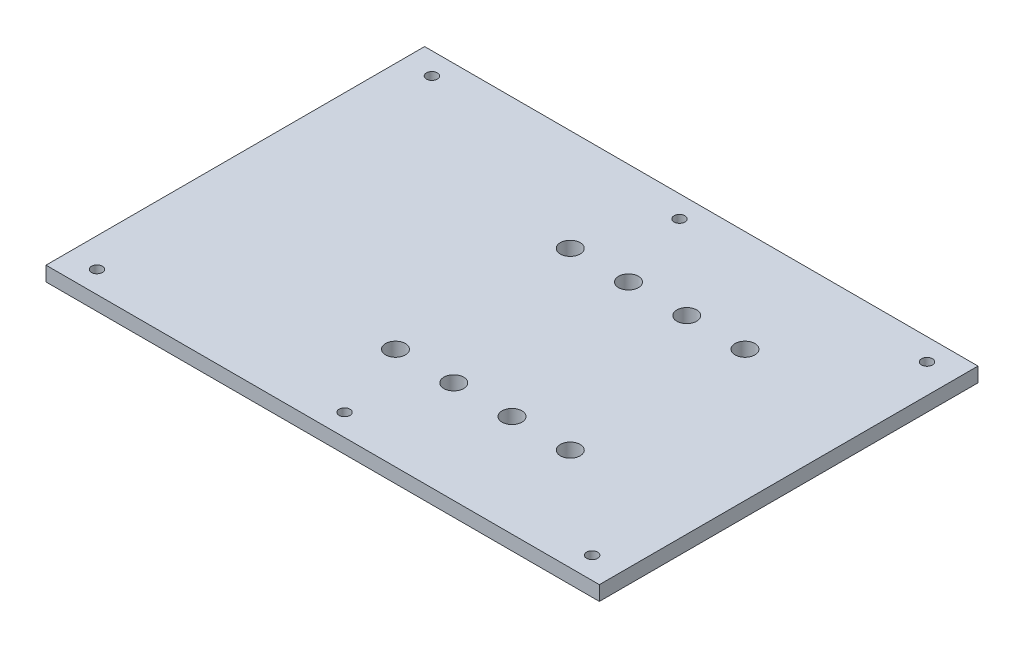
ISO-10303-21;
HEADER;
FILE_DESCRIPTION(('STEP AP214'),'2;1');
FILE_NAME('part.step','',(''),(''),'','','');
FILE_SCHEMA(('AUTOMOTIVE_DESIGN { 1 0 10303 214 1 1 1 1 }'));
ENDSEC;
DATA;
#1=APPLICATION_CONTEXT('core data for automotive mechanical design processes');
#2=APPLICATION_PROTOCOL_DEFINITION('international standard','automotive_design',2000,#1);
#3=PRODUCT_CONTEXT('',#1,'mechanical');
#4=PRODUCT('Part','Part','',(#3));
#5=PRODUCT_RELATED_PRODUCT_CATEGORY('part','',(#4));
#6=PRODUCT_DEFINITION_FORMATION('','',#4);
#7=PRODUCT_DEFINITION_CONTEXT('part definition',#1,'design');
#8=PRODUCT_DEFINITION('design','',#6,#7);
#9=PRODUCT_DEFINITION_SHAPE('','',#8);
#10=(LENGTH_UNIT() NAMED_UNIT(*) SI_UNIT(.MILLI.,.METRE.));
#11=(NAMED_UNIT(*) PLANE_ANGLE_UNIT() SI_UNIT($,.RADIAN.));
#12=(NAMED_UNIT(*) SI_UNIT($,.STERADIAN.) SOLID_ANGLE_UNIT());
#13=UNCERTAINTY_MEASURE_WITH_UNIT(LENGTH_MEASURE(1.E-05),#10,'distance_accuracy_value','');
#14=(GEOMETRIC_REPRESENTATION_CONTEXT(3) GLOBAL_UNCERTAINTY_ASSIGNED_CONTEXT((#13)) GLOBAL_UNIT_ASSIGNED_CONTEXT((#10,
#11,#12)) REPRESENTATION_CONTEXT('',''));
#15=CARTESIAN_POINT('',(0.,0.,0.));
#16=DIRECTION('',(0.,0.,1.));
#17=DIRECTION('',(1.,0.,0.));
#18=AXIS2_PLACEMENT_3D('',#15,#16,#17);
#19=CARTESIAN_POINT('',(241.3,12.7,-165.1));
#20=DIRECTION('',(-1.,0.,0.));
#21=DIRECTION('',(0.,0.,1.));
#22=AXIS2_PLACEMENT_3D('',#19,#20,#21);
#23=PLANE('',#22);
#24=DIRECTION('',(0.,0.,-1.));
#25=VECTOR('',#24,1.);
#26=CARTESIAN_POINT('',(241.3,0.,-165.1));
#27=LINE('',#26,#25);
#28=CARTESIAN_POINT('',(241.3,0.,165.1));
#29=VERTEX_POINT('',#28);
#30=CARTESIAN_POINT('',(241.3,0.,-165.1));
#31=VERTEX_POINT('',#30);
#32=EDGE_CURVE('E102',#29,#31,#27,.T.);
#33=ORIENTED_EDGE('',*,*,#32,.T.);
#34=DIRECTION('',(0.,-1.,0.));
#35=VECTOR('',#34,1.);
#36=CARTESIAN_POINT('',(241.3,12.7,-165.1));
#37=LINE('',#36,#35);
#38=CARTESIAN_POINT('',(241.3,12.7,-165.1));
#39=VERTEX_POINT('',#38);
#40=EDGE_CURVE('E11',#39,#31,#37,.T.);
#41=ORIENTED_EDGE('',*,*,#40,.F.);
#42=DIRECTION('',(0.,0.,-1.));
#43=VECTOR('',#42,1.);
#44=CARTESIAN_POINT('',(241.3,12.7,-165.1));
#45=LINE('',#44,#43);
#46=CARTESIAN_POINT('',(241.3,12.7,165.1));
#47=VERTEX_POINT('',#46);
#48=EDGE_CURVE('E90',#47,#39,#45,.T.);
#49=ORIENTED_EDGE('',*,*,#48,.F.);
#50=DIRECTION('',(0.,-1.,0.));
#51=VECTOR('',#50,1.);
#52=CARTESIAN_POINT('',(241.3,12.7,165.1));
#53=LINE('',#52,#51);
#54=EDGE_CURVE('E98',#47,#29,#53,.T.);
#55=ORIENTED_EDGE('',*,*,#54,.T.);
#56=EDGE_LOOP('',(#33,#41,#49,#55));
#57=FACE_BOUND('',#56,.T.);
#58=ADVANCED_FACE('F39',(#57),#23,.F.);
#59=CARTESIAN_POINT('',(-241.3,12.7,-165.1));
#60=DIRECTION('',(0.,0.,1.));
#61=DIRECTION('',(1.,0.,0.));
#62=AXIS2_PLACEMENT_3D('',#59,#60,#61);
#63=PLANE('',#62);
#64=DIRECTION('',(-1.,0.,0.));
#65=VECTOR('',#64,1.);
#66=CARTESIAN_POINT('',(-241.3,0.,-165.1));
#67=LINE('',#66,#65);
#68=CARTESIAN_POINT('',(-241.3,0.,-165.1));
#69=VERTEX_POINT('',#68);
#70=EDGE_CURVE('E94',#31,#69,#67,.T.);
#71=ORIENTED_EDGE('',*,*,#70,.T.);
#72=DIRECTION('',(0.,-1.,0.));
#73=VECTOR('',#72,1.);
#74=CARTESIAN_POINT('',(-241.3,12.7,-165.1));
#75=LINE('',#74,#73);
#76=CARTESIAN_POINT('',(-241.3,12.7,-165.1));
#77=VERTEX_POINT('',#76);
#78=EDGE_CURVE('E47',#77,#69,#75,.T.);
#79=ORIENTED_EDGE('',*,*,#78,.F.);
#80=DIRECTION('',(-1.,0.,0.));
#81=VECTOR('',#80,1.);
#82=CARTESIAN_POINT('',(-241.3,12.7,-165.1));
#83=LINE('',#82,#81);
#84=EDGE_CURVE('E85',#39,#77,#83,.T.);
#85=ORIENTED_EDGE('',*,*,#84,.F.);
#86=ORIENTED_EDGE('',*,*,#40,.T.);
#87=EDGE_LOOP('',(#71,#79,#85,#86));
#88=FACE_BOUND('',#87,.T.);
#89=ADVANCED_FACE('F93',(#88),#63,.F.);
#90=CARTESIAN_POINT('',(-241.3,12.7,-165.1));
#91=DIRECTION('',(1.,0.,0.));
#92=DIRECTION('',(0.,0.,-1.));
#93=AXIS2_PLACEMENT_3D('',#90,#91,#92);
#94=PLANE('',#93);
#95=DIRECTION('',(0.,0.,1.));
#96=VECTOR('',#95,1.);
#97=CARTESIAN_POINT('',(-241.3,0.,-165.1));
#98=LINE('',#97,#96);
#99=CARTESIAN_POINT('',(-241.3,0.,165.1));
#100=VERTEX_POINT('',#99);
#101=EDGE_CURVE('E72',#69,#100,#98,.T.);
#102=ORIENTED_EDGE('',*,*,#101,.T.);
#103=DIRECTION('',(0.,-1.,0.));
#104=VECTOR('',#103,1.);
#105=CARTESIAN_POINT('',(-241.3,12.7,165.1));
#106=LINE('',#105,#104);
#107=CARTESIAN_POINT('',(-241.3,12.7,165.1));
#108=VERTEX_POINT('',#107);
#109=EDGE_CURVE('E95',#108,#100,#106,.T.);
#110=ORIENTED_EDGE('',*,*,#109,.F.);
#111=DIRECTION('',(0.,0.,1.));
#112=VECTOR('',#111,1.);
#113=CARTESIAN_POINT('',(-241.3,12.7,-165.1));
#114=LINE('',#113,#112);
#115=EDGE_CURVE('E88',#77,#108,#114,.T.);
#116=ORIENTED_EDGE('',*,*,#115,.F.);
#117=ORIENTED_EDGE('',*,*,#78,.T.);
#118=EDGE_LOOP('',(#102,#110,#116,#117));
#119=FACE_BOUND('',#118,.T.);
#120=ADVANCED_FACE('F96',(#119),#94,.F.);
#121=CARTESIAN_POINT('',(-241.3,12.7,165.1));
#122=DIRECTION('',(0.,0.,-1.));
#123=DIRECTION('',(-1.,0.,0.));
#124=AXIS2_PLACEMENT_3D('',#121,#122,#123);
#125=PLANE('',#124);
#126=DIRECTION('',(1.,0.,0.));
#127=VECTOR('',#126,1.);
#128=CARTESIAN_POINT('',(-241.3,0.,165.1));
#129=LINE('',#128,#127);
#130=EDGE_CURVE('E78',#100,#29,#129,.T.);
#131=ORIENTED_EDGE('',*,*,#130,.T.);
#132=ORIENTED_EDGE('',*,*,#54,.F.);
#133=DIRECTION('',(1.,0.,0.));
#134=VECTOR('',#133,1.);
#135=CARTESIAN_POINT('',(-241.3,12.7,165.1));
#136=LINE('',#135,#134);
#137=EDGE_CURVE('E55',#108,#47,#136,.T.);
#138=ORIENTED_EDGE('',*,*,#137,.F.);
#139=ORIENTED_EDGE('',*,*,#109,.T.);
#140=EDGE_LOOP('',(#131,#132,#138,#139));
#141=FACE_BOUND('',#140,.T.);
#142=ADVANCED_FACE('F110',(#141),#125,.F.);
#143=CARTESIAN_POINT('',(0.,12.7,0.));
#144=DIRECTION('',(0.,1.,0.));
#145=DIRECTION('',(0.,0.,1.));
#146=AXIS2_PLACEMENT_3D('',#143,#144,#145);
#147=PLANE('',#146);
#148=CARTESIAN_POINT('',(25.3999999999998,12.7,-76.2));
#149=DIRECTION('',(0.,1.,0.));
#150=DIRECTION('',(0.,0.,1.));
#151=AXIS2_PLACEMENT_3D('',#148,#149,#150);
#152=CIRCLE('',#151,8.636);
#153=CARTESIAN_POINT('',(25.3999999999998,12.7,-67.564));
#154=VERTEX_POINT('',#153);
#155=EDGE_CURVE('E151',#154,#154,#152,.T.);
#156=ORIENTED_EDGE('',*,*,#155,.F.);
#157=EDGE_LOOP('',(#156));
#158=FACE_BOUND('',#157,.T.);
#159=CARTESIAN_POINT('',(76.1999999999998,12.7,-76.2));
#160=DIRECTION('',(0.,1.,0.));
#161=DIRECTION('',(0.,0.,1.));
#162=AXIS2_PLACEMENT_3D('',#159,#160,#161);
#163=CIRCLE('',#162,8.63600000000001);
#164=CARTESIAN_POINT('',(76.1999999999998,12.7,-67.564));
#165=VERTEX_POINT('',#164);
#166=EDGE_CURVE('E154',#165,#165,#163,.T.);
#167=ORIENTED_EDGE('',*,*,#166,.F.);
#168=EDGE_LOOP('',(#167));
#169=FACE_BOUND('',#168,.T.);
#170=CARTESIAN_POINT('',(127.,12.7,-76.2));
#171=DIRECTION('',(0.,1.,0.));
#172=DIRECTION('',(0.,0.,1.));
#173=AXIS2_PLACEMENT_3D('',#170,#171,#172);
#174=CIRCLE('',#173,8.63600000000001);
#175=CARTESIAN_POINT('',(127.,12.7,-67.564));
#176=VERTEX_POINT('',#175);
#177=EDGE_CURVE('E157',#176,#176,#174,.T.);
#178=ORIENTED_EDGE('',*,*,#177,.F.);
#179=EDGE_LOOP('',(#178));
#180=FACE_BOUND('',#179,.T.);
#181=CARTESIAN_POINT('',(127.,12.7,76.2));
#182=DIRECTION('',(0.,1.,0.));
#183=DIRECTION('',(0.,0.,1.));
#184=AXIS2_PLACEMENT_3D('',#181,#182,#183);
#185=CIRCLE('',#184,8.63600000000001);
#186=CARTESIAN_POINT('',(127.,12.7,84.836));
#187=VERTEX_POINT('',#186);
#188=EDGE_CURVE('E160',#187,#187,#185,.T.);
#189=ORIENTED_EDGE('',*,*,#188,.F.);
#190=EDGE_LOOP('',(#189));
#191=FACE_BOUND('',#190,.T.);
#192=CARTESIAN_POINT('',(76.1999999999998,12.7,76.2));
#193=DIRECTION('',(0.,1.,0.));
#194=DIRECTION('',(0.,0.,1.));
#195=AXIS2_PLACEMENT_3D('',#192,#193,#194);
#196=CIRCLE('',#195,8.63600000000001);
#197=CARTESIAN_POINT('',(76.1999999999998,12.7,84.836));
#198=VERTEX_POINT('',#197);
#199=EDGE_CURVE('E163',#198,#198,#196,.T.);
#200=ORIENTED_EDGE('',*,*,#199,.F.);
#201=EDGE_LOOP('',(#200));
#202=FACE_BOUND('',#201,.T.);
#203=CARTESIAN_POINT('',(25.3999999999998,12.7,76.2));
#204=DIRECTION('',(0.,1.,0.));
#205=DIRECTION('',(0.,0.,1.));
#206=AXIS2_PLACEMENT_3D('',#203,#204,#205);
#207=CIRCLE('',#206,8.636);
#208=CARTESIAN_POINT('',(25.3999999999998,12.7,84.836));
#209=VERTEX_POINT('',#208);
#210=EDGE_CURVE('E166',#209,#209,#207,.T.);
#211=ORIENTED_EDGE('',*,*,#210,.F.);
#212=EDGE_LOOP('',(#211));
#213=FACE_BOUND('',#212,.T.);
#214=CARTESIAN_POINT('',(-25.4000000000002,12.7,76.2));
#215=DIRECTION('',(0.,1.,0.));
#216=DIRECTION('',(0.,0.,1.));
#217=AXIS2_PLACEMENT_3D('',#214,#215,#216);
#218=CIRCLE('',#217,8.636);
#219=CARTESIAN_POINT('',(-25.4000000000002,12.7,84.836));
#220=VERTEX_POINT('',#219);
#221=EDGE_CURVE('E169',#220,#220,#218,.T.);
#222=ORIENTED_EDGE('',*,*,#221,.F.);
#223=EDGE_LOOP('',(#222));
#224=FACE_BOUND('',#223,.T.);
#225=CARTESIAN_POINT('',(-25.4000000000002,12.7,-76.2));
#226=DIRECTION('',(0.,1.,0.));
#227=DIRECTION('',(0.,0.,1.));
#228=AXIS2_PLACEMENT_3D('',#225,#226,#227);
#229=CIRCLE('',#228,8.636);
#230=CARTESIAN_POINT('',(-25.4000000000002,12.7,-67.564));
#231=VERTEX_POINT('',#230);
#232=EDGE_CURVE('E172',#231,#231,#229,.T.);
#233=ORIENTED_EDGE('',*,*,#232,.F.);
#234=EDGE_LOOP('',(#233));
#235=FACE_BOUND('',#234,.T.);
#236=CARTESIAN_POINT('',(0.,12.7,-146.05));
#237=DIRECTION('',(0.,1.,0.));
#238=DIRECTION('',(0.,0.,1.));
#239=AXIS2_PLACEMENT_3D('',#236,#237,#238);
#240=CIRCLE('',#239,4.7625);
#241=CARTESIAN_POINT('',(0.,12.7,-141.2875));
#242=VERTEX_POINT('',#241);
#243=EDGE_CURVE('E105',#242,#242,#240,.T.);
#244=ORIENTED_EDGE('',*,*,#243,.F.);
#245=EDGE_LOOP('',(#244));
#246=FACE_BOUND('',#245,.T.);
#247=CARTESIAN_POINT('',(-215.9,12.7,146.05));
#248=DIRECTION('',(0.,1.,0.));
#249=DIRECTION('',(0.,0.,1.));
#250=AXIS2_PLACEMENT_3D('',#247,#248,#249);
#251=CIRCLE('',#250,4.76250000000001);
#252=CARTESIAN_POINT('',(-215.9,12.7,150.8125));
#253=VERTEX_POINT('',#252);
#254=EDGE_CURVE('E118',#253,#253,#251,.T.);
#255=ORIENTED_EDGE('',*,*,#254,.F.);
#256=EDGE_LOOP('',(#255));
#257=FACE_BOUND('',#256,.T.);
#258=CARTESIAN_POINT('',(215.9,12.7,146.05));
#259=DIRECTION('',(0.,1.,0.));
#260=DIRECTION('',(0.,0.,1.));
#261=AXIS2_PLACEMENT_3D('',#258,#259,#260);
#262=CIRCLE('',#261,4.76250000000001);
#263=CARTESIAN_POINT('',(215.9,12.7,150.8125));
#264=VERTEX_POINT('',#263);
#265=EDGE_CURVE('E121',#264,#264,#262,.T.);
#266=ORIENTED_EDGE('',*,*,#265,.F.);
#267=EDGE_LOOP('',(#266));
#268=FACE_BOUND('',#267,.T.);
#269=CARTESIAN_POINT('',(-215.9,12.7,-146.05));
#270=DIRECTION('',(0.,1.,0.));
#271=DIRECTION('',(0.,0.,1.));
#272=AXIS2_PLACEMENT_3D('',#269,#270,#271);
#273=CIRCLE('',#272,4.76250000000001);
#274=CARTESIAN_POINT('',(-215.9,12.7,-141.2875));
#275=VERTEX_POINT('',#274);
#276=EDGE_CURVE('E124',#275,#275,#273,.T.);
#277=ORIENTED_EDGE('',*,*,#276,.F.);
#278=EDGE_LOOP('',(#277));
#279=FACE_BOUND('',#278,.T.);
#280=CARTESIAN_POINT('',(0.,12.7,146.05));
#281=DIRECTION('',(0.,1.,0.));
#282=DIRECTION('',(0.,0.,1.));
#283=AXIS2_PLACEMENT_3D('',#280,#281,#282);
#284=CIRCLE('',#283,4.7625);
#285=CARTESIAN_POINT('',(0.,12.7,150.8125));
#286=VERTEX_POINT('',#285);
#287=EDGE_CURVE('E127',#286,#286,#284,.T.);
#288=ORIENTED_EDGE('',*,*,#287,.F.);
#289=EDGE_LOOP('',(#288));
#290=FACE_BOUND('',#289,.T.);
#291=CARTESIAN_POINT('',(215.9,12.7,-146.05));
#292=DIRECTION('',(0.,1.,0.));
#293=DIRECTION('',(0.,0.,1.));
#294=AXIS2_PLACEMENT_3D('',#291,#292,#293);
#295=CIRCLE('',#294,4.76250000000001);
#296=CARTESIAN_POINT('',(215.9,12.7,-141.2875));
#297=VERTEX_POINT('',#296);
#298=EDGE_CURVE('E130',#297,#297,#295,.T.);
#299=ORIENTED_EDGE('',*,*,#298,.F.);
#300=EDGE_LOOP('',(#299));
#301=FACE_BOUND('',#300,.T.);
#302=ORIENTED_EDGE('',*,*,#48,.T.);
#303=ORIENTED_EDGE('',*,*,#84,.T.);
#304=ORIENTED_EDGE('',*,*,#115,.T.);
#305=ORIENTED_EDGE('',*,*,#137,.T.);
#306=EDGE_LOOP('',(#302,#303,#304,#305));
#307=FACE_BOUND('',#306,.T.);
#308=ADVANCED_FACE('F86',(#158,#169,#180,#191,#202,#213,#224,#235,#246,#257,#268,#279,#290,#301,
#307),#147,.T.);
#309=CARTESIAN_POINT('',(0.,0.,0.));
#310=DIRECTION('',(0.,1.,0.));
#311=DIRECTION('',(0.,0.,1.));
#312=AXIS2_PLACEMENT_3D('',#309,#310,#311);
#313=PLANE('',#312);
#314=CARTESIAN_POINT('',(25.3999999999998,0.,-76.2));
#315=DIRECTION('',(0.,1.,0.));
#316=DIRECTION('',(0.,0.,1.));
#317=AXIS2_PLACEMENT_3D('',#314,#315,#316);
#318=CIRCLE('',#317,8.636);
#319=CARTESIAN_POINT('',(25.3999999999998,0.,-67.564));
#320=VERTEX_POINT('',#319);
#321=EDGE_CURVE('E178',#320,#320,#318,.T.);
#322=ORIENTED_EDGE('',*,*,#321,.T.);
#323=EDGE_LOOP('',(#322));
#324=FACE_BOUND('',#323,.T.);
#325=CARTESIAN_POINT('',(76.1999999999998,0.,-76.2));
#326=DIRECTION('',(0.,1.,0.));
#327=DIRECTION('',(0.,0.,1.));
#328=AXIS2_PLACEMENT_3D('',#325,#326,#327);
#329=CIRCLE('',#328,8.63600000000001);
#330=CARTESIAN_POINT('',(76.1999999999998,0.,-67.564));
#331=VERTEX_POINT('',#330);
#332=EDGE_CURVE('E186',#331,#331,#329,.T.);
#333=ORIENTED_EDGE('',*,*,#332,.T.);
#334=EDGE_LOOP('',(#333));
#335=FACE_BOUND('',#334,.T.);
#336=CARTESIAN_POINT('',(127.,0.,-76.2));
#337=DIRECTION('',(0.,1.,0.));
#338=DIRECTION('',(0.,0.,1.));
#339=AXIS2_PLACEMENT_3D('',#336,#337,#338);
#340=CIRCLE('',#339,8.63600000000001);
#341=CARTESIAN_POINT('',(127.,0.,-67.564));
#342=VERTEX_POINT('',#341);
#343=EDGE_CURVE('E182',#342,#342,#340,.T.);
#344=ORIENTED_EDGE('',*,*,#343,.T.);
#345=EDGE_LOOP('',(#344));
#346=FACE_BOUND('',#345,.T.);
#347=CARTESIAN_POINT('',(127.,0.,76.2));
#348=DIRECTION('',(0.,1.,0.));
#349=DIRECTION('',(0.,0.,-1.));
#350=AXIS2_PLACEMENT_3D('',#347,#348,#349);
#351=CIRCLE('',#350,8.63600000000001);
#352=CARTESIAN_POINT('',(127.,0.,67.564));
#353=VERTEX_POINT('',#352);
#354=EDGE_CURVE('E179',#353,#353,#351,.T.);
#355=ORIENTED_EDGE('',*,*,#354,.T.);
#356=EDGE_LOOP('',(#355));
#357=FACE_BOUND('',#356,.T.);
#358=CARTESIAN_POINT('',(76.1999999999998,0.,76.2));
#359=DIRECTION('',(0.,1.,0.));
#360=DIRECTION('',(0.,0.,-1.));
#361=AXIS2_PLACEMENT_3D('',#358,#359,#360);
#362=CIRCLE('',#361,8.63600000000001);
#363=CARTESIAN_POINT('',(76.1999999999998,0.,67.564));
#364=VERTEX_POINT('',#363);
#365=EDGE_CURVE('E183',#364,#364,#362,.T.);
#366=ORIENTED_EDGE('',*,*,#365,.T.);
#367=EDGE_LOOP('',(#366));
#368=FACE_BOUND('',#367,.T.);
#369=CARTESIAN_POINT('',(25.3999999999998,0.,76.2));
#370=DIRECTION('',(0.,1.,0.));
#371=DIRECTION('',(0.,0.,-1.));
#372=AXIS2_PLACEMENT_3D('',#369,#370,#371);
#373=CIRCLE('',#372,8.636);
#374=CARTESIAN_POINT('',(25.3999999999998,0.,67.564));
#375=VERTEX_POINT('',#374);
#376=EDGE_CURVE('E194',#375,#375,#373,.T.);
#377=ORIENTED_EDGE('',*,*,#376,.T.);
#378=EDGE_LOOP('',(#377));
#379=FACE_BOUND('',#378,.T.);
#380=CARTESIAN_POINT('',(-25.4000000000002,0.,76.2));
#381=DIRECTION('',(0.,1.,0.));
#382=DIRECTION('',(0.,0.,-1.));
#383=AXIS2_PLACEMENT_3D('',#380,#381,#382);
#384=CIRCLE('',#383,8.636);
#385=CARTESIAN_POINT('',(-25.4000000000002,0.,67.564));
#386=VERTEX_POINT('',#385);
#387=EDGE_CURVE('E191',#386,#386,#384,.T.);
#388=ORIENTED_EDGE('',*,*,#387,.T.);
#389=EDGE_LOOP('',(#388));
#390=FACE_BOUND('',#389,.T.);
#391=CARTESIAN_POINT('',(-25.4000000000002,0.,-76.2));
#392=DIRECTION('',(0.,1.,0.));
#393=DIRECTION('',(0.,0.,1.));
#394=AXIS2_PLACEMENT_3D('',#391,#392,#393);
#395=CIRCLE('',#394,8.636);
#396=CARTESIAN_POINT('',(-25.4000000000002,0.,-67.564));
#397=VERTEX_POINT('',#396);
#398=EDGE_CURVE('E175',#397,#397,#395,.T.);
#399=ORIENTED_EDGE('',*,*,#398,.T.);
#400=EDGE_LOOP('',(#399));
#401=FACE_BOUND('',#400,.T.);
#402=CARTESIAN_POINT('',(0.,0.,-146.05));
#403=DIRECTION('',(0.,1.,0.));
#404=DIRECTION('',(0.,0.,1.));
#405=AXIS2_PLACEMENT_3D('',#402,#403,#404);
#406=CIRCLE('',#405,4.7625);
#407=CARTESIAN_POINT('',(0.,0.,-141.2875));
#408=VERTEX_POINT('',#407);
#409=EDGE_CURVE('E143',#408,#408,#406,.T.);
#410=ORIENTED_EDGE('',*,*,#409,.T.);
#411=EDGE_LOOP('',(#410));
#412=FACE_BOUND('',#411,.T.);
#413=CARTESIAN_POINT('',(-215.9,0.,146.05));
#414=DIRECTION('',(0.,1.,0.));
#415=DIRECTION('',(0.,0.,1.));
#416=AXIS2_PLACEMENT_3D('',#413,#414,#415);
#417=CIRCLE('',#416,4.76250000000001);
#418=CARTESIAN_POINT('',(-215.9,0.,150.8125));
#419=VERTEX_POINT('',#418);
#420=EDGE_CURVE('E140',#419,#419,#417,.T.);
#421=ORIENTED_EDGE('',*,*,#420,.T.);
#422=EDGE_LOOP('',(#421));
#423=FACE_BOUND('',#422,.T.);
#424=CARTESIAN_POINT('',(215.9,0.,146.05));
#425=DIRECTION('',(0.,1.,0.));
#426=DIRECTION('',(0.,0.,1.));
#427=AXIS2_PLACEMENT_3D('',#424,#425,#426);
#428=CIRCLE('',#427,4.76250000000001);
#429=CARTESIAN_POINT('',(215.9,0.,150.8125));
#430=VERTEX_POINT('',#429);
#431=EDGE_CURVE('E137',#430,#430,#428,.T.);
#432=ORIENTED_EDGE('',*,*,#431,.T.);
#433=EDGE_LOOP('',(#432));
#434=FACE_BOUND('',#433,.T.);
#435=CARTESIAN_POINT('',(-215.9,0.,-146.05));
#436=DIRECTION('',(0.,1.,0.));
#437=DIRECTION('',(0.,0.,1.));
#438=AXIS2_PLACEMENT_3D('',#435,#436,#437);
#439=CIRCLE('',#438,4.76250000000001);
#440=CARTESIAN_POINT('',(-215.9,0.,-141.2875));
#441=VERTEX_POINT('',#440);
#442=EDGE_CURVE('E136',#441,#441,#439,.T.);
#443=ORIENTED_EDGE('',*,*,#442,.T.);
#444=EDGE_LOOP('',(#443));
#445=FACE_BOUND('',#444,.T.);
#446=CARTESIAN_POINT('',(0.,0.,146.05));
#447=DIRECTION('',(0.,1.,0.));
#448=DIRECTION('',(0.,0.,1.));
#449=AXIS2_PLACEMENT_3D('',#446,#447,#448);
#450=CIRCLE('',#449,4.7625);
#451=CARTESIAN_POINT('',(0.,0.,150.8125));
#452=VERTEX_POINT('',#451);
#453=EDGE_CURVE('E146',#452,#452,#450,.T.);
#454=ORIENTED_EDGE('',*,*,#453,.T.);
#455=EDGE_LOOP('',(#454));
#456=FACE_BOUND('',#455,.T.);
#457=CARTESIAN_POINT('',(215.9,0.,-146.05));
#458=DIRECTION('',(0.,1.,0.));
#459=DIRECTION('',(0.,0.,1.));
#460=AXIS2_PLACEMENT_3D('',#457,#458,#459);
#461=CIRCLE('',#460,4.76250000000001);
#462=CARTESIAN_POINT('',(215.9,0.,-141.2875));
#463=VERTEX_POINT('',#462);
#464=EDGE_CURVE('E133',#463,#463,#461,.T.);
#465=ORIENTED_EDGE('',*,*,#464,.T.);
#466=EDGE_LOOP('',(#465));
#467=FACE_BOUND('',#466,.T.);
#468=ORIENTED_EDGE('',*,*,#32,.F.);
#469=ORIENTED_EDGE('',*,*,#130,.F.);
#470=ORIENTED_EDGE('',*,*,#101,.F.);
#471=ORIENTED_EDGE('',*,*,#70,.F.);
#472=EDGE_LOOP('',(#468,#469,#470,#471));
#473=FACE_BOUND('',#472,.T.);
#474=ADVANCED_FACE('F113',(#324,#335,#346,#357,#368,#379,#390,#401,#412,#423,#434,#445,#456,
#467,#473),#313,.F.);
#475=CARTESIAN_POINT('',(215.9,0.,-146.05));
#476=DIRECTION('',(0.,1.,0.));
#477=DIRECTION('',(0.,0.,1.));
#478=AXIS2_PLACEMENT_3D('',#475,#476,#477);
#479=CYLINDRICAL_SURFACE('',#478,4.76250000000001);
#480=ORIENTED_EDGE('',*,*,#298,.T.);
#481=EDGE_LOOP('',(#480));
#482=FACE_BOUND('',#481,.T.);
#483=ORIENTED_EDGE('',*,*,#464,.F.);
#484=EDGE_LOOP('',(#483));
#485=FACE_BOUND('',#484,.T.);
#486=ADVANCED_FACE('F231',(#482,#485),#479,.F.);
#487=CARTESIAN_POINT('',(0.,0.,146.05));
#488=DIRECTION('',(0.,1.,0.));
#489=DIRECTION('',(0.,0.,1.));
#490=AXIS2_PLACEMENT_3D('',#487,#488,#489);
#491=CYLINDRICAL_SURFACE('',#490,4.7625);
#492=ORIENTED_EDGE('',*,*,#287,.T.);
#493=EDGE_LOOP('',(#492));
#494=FACE_BOUND('',#493,.T.);
#495=ORIENTED_EDGE('',*,*,#453,.F.);
#496=EDGE_LOOP('',(#495));
#497=FACE_BOUND('',#496,.T.);
#498=ADVANCED_FACE('F238',(#494,#497),#491,.F.);
#499=CARTESIAN_POINT('',(-215.9,0.,-146.05));
#500=DIRECTION('',(0.,1.,0.));
#501=DIRECTION('',(0.,0.,1.));
#502=AXIS2_PLACEMENT_3D('',#499,#500,#501);
#503=CYLINDRICAL_SURFACE('',#502,4.76250000000001);
#504=ORIENTED_EDGE('',*,*,#276,.T.);
#505=EDGE_LOOP('',(#504));
#506=FACE_BOUND('',#505,.T.);
#507=ORIENTED_EDGE('',*,*,#442,.F.);
#508=EDGE_LOOP('',(#507));
#509=FACE_BOUND('',#508,.T.);
#510=ADVANCED_FACE('F244',(#506,#509),#503,.F.);
#511=CARTESIAN_POINT('',(215.9,0.,146.05));
#512=DIRECTION('',(0.,1.,0.));
#513=DIRECTION('',(0.,0.,1.));
#514=AXIS2_PLACEMENT_3D('',#511,#512,#513);
#515=CYLINDRICAL_SURFACE('',#514,4.76250000000001);
#516=ORIENTED_EDGE('',*,*,#265,.T.);
#517=EDGE_LOOP('',(#516));
#518=FACE_BOUND('',#517,.T.);
#519=ORIENTED_EDGE('',*,*,#431,.F.);
#520=EDGE_LOOP('',(#519));
#521=FACE_BOUND('',#520,.T.);
#522=ADVANCED_FACE('F240',(#518,#521),#515,.F.);
#523=CARTESIAN_POINT('',(-215.9,0.,146.05));
#524=DIRECTION('',(0.,1.,0.));
#525=DIRECTION('',(0.,0.,1.));
#526=AXIS2_PLACEMENT_3D('',#523,#524,#525);
#527=CYLINDRICAL_SURFACE('',#526,4.76250000000001);
#528=ORIENTED_EDGE('',*,*,#254,.T.);
#529=EDGE_LOOP('',(#528));
#530=FACE_BOUND('',#529,.T.);
#531=ORIENTED_EDGE('',*,*,#420,.F.);
#532=EDGE_LOOP('',(#531));
#533=FACE_BOUND('',#532,.T.);
#534=ADVANCED_FACE('F243',(#530,#533),#527,.F.);
#535=CARTESIAN_POINT('',(0.,0.,-146.05));
#536=DIRECTION('',(0.,1.,0.));
#537=DIRECTION('',(0.,0.,1.));
#538=AXIS2_PLACEMENT_3D('',#535,#536,#537);
#539=CYLINDRICAL_SURFACE('',#538,4.7625);
#540=ORIENTED_EDGE('',*,*,#243,.T.);
#541=EDGE_LOOP('',(#540));
#542=FACE_BOUND('',#541,.T.);
#543=ORIENTED_EDGE('',*,*,#409,.F.);
#544=EDGE_LOOP('',(#543));
#545=FACE_BOUND('',#544,.T.);
#546=ADVANCED_FACE('F249',(#542,#545),#539,.F.);
#547=CARTESIAN_POINT('',(-25.4000000000002,0.,-76.2));
#548=DIRECTION('',(0.,1.,0.));
#549=DIRECTION('',(0.,0.,1.));
#550=AXIS2_PLACEMENT_3D('',#547,#548,#549);
#551=CYLINDRICAL_SURFACE('',#550,8.636);
#552=ORIENTED_EDGE('',*,*,#232,.T.);
#553=EDGE_LOOP('',(#552));
#554=FACE_BOUND('',#553,.T.);
#555=ORIENTED_EDGE('',*,*,#398,.F.);
#556=EDGE_LOOP('',(#555));
#557=FACE_BOUND('',#556,.T.);
#558=ADVANCED_FACE('F252',(#554,#557),#551,.F.);
#559=CARTESIAN_POINT('',(-25.4000000000002,0.,76.2));
#560=DIRECTION('',(0.,1.,0.));
#561=DIRECTION('',(0.,0.,1.));
#562=AXIS2_PLACEMENT_3D('',#559,#560,#561);
#563=CYLINDRICAL_SURFACE('',#562,8.636);
#564=ORIENTED_EDGE('',*,*,#221,.T.);
#565=EDGE_LOOP('',(#564));
#566=FACE_BOUND('',#565,.T.);
#567=ORIENTED_EDGE('',*,*,#387,.F.);
#568=EDGE_LOOP('',(#567));
#569=FACE_BOUND('',#568,.T.);
#570=ADVANCED_FACE('F215',(#566,#569),#563,.F.);
#571=CARTESIAN_POINT('',(25.3999999999998,0.,76.2));
#572=DIRECTION('',(0.,1.,0.));
#573=DIRECTION('',(0.,0.,1.));
#574=AXIS2_PLACEMENT_3D('',#571,#572,#573);
#575=CYLINDRICAL_SURFACE('',#574,8.636);
#576=ORIENTED_EDGE('',*,*,#210,.T.);
#577=EDGE_LOOP('',(#576));
#578=FACE_BOUND('',#577,.T.);
#579=ORIENTED_EDGE('',*,*,#376,.F.);
#580=EDGE_LOOP('',(#579));
#581=FACE_BOUND('',#580,.T.);
#582=ADVANCED_FACE('F205',(#578,#581),#575,.F.);
#583=CARTESIAN_POINT('',(76.1999999999998,0.,76.2));
#584=DIRECTION('',(0.,1.,0.));
#585=DIRECTION('',(0.,0.,1.));
#586=AXIS2_PLACEMENT_3D('',#583,#584,#585);
#587=CYLINDRICAL_SURFACE('',#586,8.63600000000001);
#588=ORIENTED_EDGE('',*,*,#199,.T.);
#589=EDGE_LOOP('',(#588));
#590=FACE_BOUND('',#589,.T.);
#591=ORIENTED_EDGE('',*,*,#365,.F.);
#592=EDGE_LOOP('',(#591));
#593=FACE_BOUND('',#592,.T.);
#594=ADVANCED_FACE('F202',(#590,#593),#587,.F.);
#595=CARTESIAN_POINT('',(127.,0.,76.2));
#596=DIRECTION('',(0.,1.,0.));
#597=DIRECTION('',(0.,0.,1.));
#598=AXIS2_PLACEMENT_3D('',#595,#596,#597);
#599=CYLINDRICAL_SURFACE('',#598,8.63600000000001);
#600=ORIENTED_EDGE('',*,*,#188,.T.);
#601=EDGE_LOOP('',(#600));
#602=FACE_BOUND('',#601,.T.);
#603=ORIENTED_EDGE('',*,*,#354,.F.);
#604=EDGE_LOOP('',(#603));
#605=FACE_BOUND('',#604,.T.);
#606=ADVANCED_FACE('F204',(#602,#605),#599,.F.);
#607=CARTESIAN_POINT('',(127.,0.,-76.2));
#608=DIRECTION('',(0.,1.,0.));
#609=DIRECTION('',(0.,0.,1.));
#610=AXIS2_PLACEMENT_3D('',#607,#608,#609);
#611=CYLINDRICAL_SURFACE('',#610,8.63600000000001);
#612=ORIENTED_EDGE('',*,*,#177,.T.);
#613=EDGE_LOOP('',(#612));
#614=FACE_BOUND('',#613,.T.);
#615=ORIENTED_EDGE('',*,*,#343,.F.);
#616=EDGE_LOOP('',(#615));
#617=FACE_BOUND('',#616,.T.);
#618=ADVANCED_FACE('F212',(#614,#617),#611,.F.);
#619=CARTESIAN_POINT('',(76.1999999999998,0.,-76.2));
#620=DIRECTION('',(0.,1.,0.));
#621=DIRECTION('',(0.,0.,1.));
#622=AXIS2_PLACEMENT_3D('',#619,#620,#621);
#623=CYLINDRICAL_SURFACE('',#622,8.63600000000001);
#624=ORIENTED_EDGE('',*,*,#166,.T.);
#625=EDGE_LOOP('',(#624));
#626=FACE_BOUND('',#625,.T.);
#627=ORIENTED_EDGE('',*,*,#332,.F.);
#628=EDGE_LOOP('',(#627));
#629=FACE_BOUND('',#628,.T.);
#630=ADVANCED_FACE('F265',(#626,#629),#623,.F.);
#631=CARTESIAN_POINT('',(25.3999999999998,0.,-76.2));
#632=DIRECTION('',(0.,1.,0.));
#633=DIRECTION('',(0.,0.,1.));
#634=AXIS2_PLACEMENT_3D('',#631,#632,#633);
#635=CYLINDRICAL_SURFACE('',#634,8.636);
#636=ORIENTED_EDGE('',*,*,#155,.T.);
#637=EDGE_LOOP('',(#636));
#638=FACE_BOUND('',#637,.T.);
#639=ORIENTED_EDGE('',*,*,#321,.F.);
#640=EDGE_LOOP('',(#639));
#641=FACE_BOUND('',#640,.T.);
#642=ADVANCED_FACE('F269',(#638,#641),#635,.F.);
#643=CLOSED_SHELL('',(#58,#89,#120,#142,#308,#474,#486,#498,#510,#522,#534,#546,#558,#570,#582,
#594,#606,#618,#630,#642));
#644=MANIFOLD_SOLID_BREP('B2',#643);
#645=ADVANCED_BREP_SHAPE_REPRESENTATION('',(#18,#644),#14);
#646=SHAPE_DEFINITION_REPRESENTATION(#9,#645);
ENDSEC;
END-ISO-10303-21;
